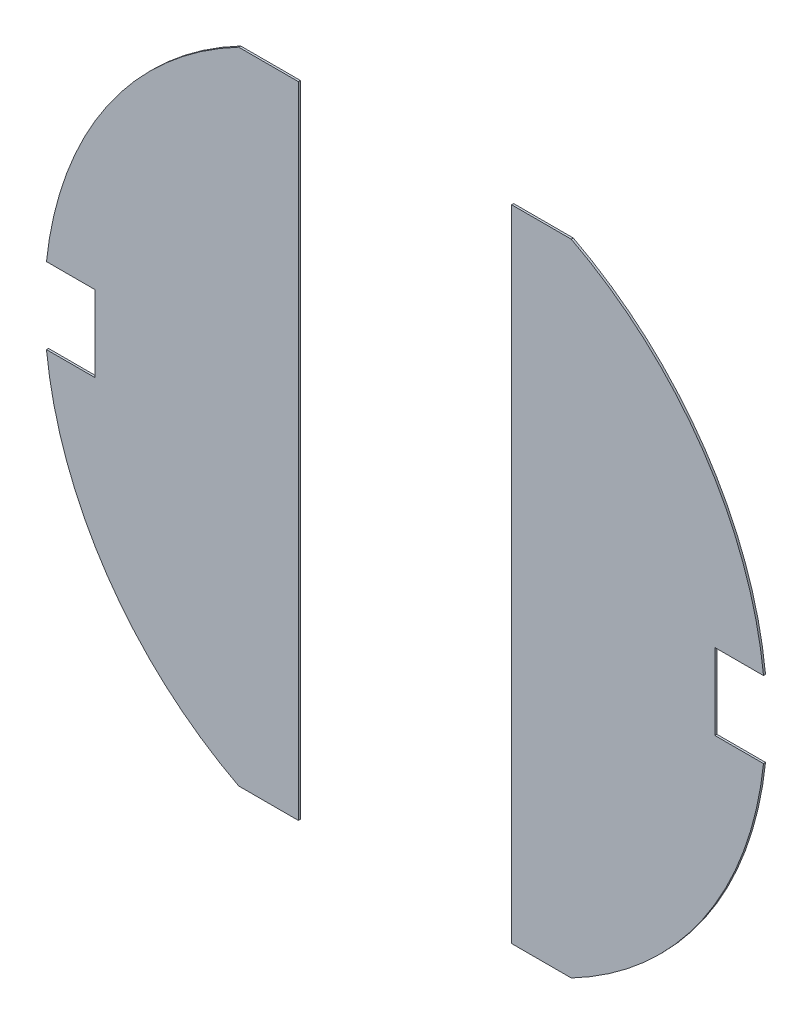
ISO-10303-21;
HEADER;
FILE_DESCRIPTION(('STEP AP214'),'2;1');
FILE_NAME('part.step','',(''),(''),'','','');
FILE_SCHEMA(('AUTOMOTIVE_DESIGN { 1 0 10303 214 1 1 1 1 }'));
ENDSEC;
DATA;
#1=APPLICATION_CONTEXT('core data for automotive mechanical design processes');
#2=APPLICATION_PROTOCOL_DEFINITION('international standard','automotive_design',2000,#1);
#3=PRODUCT_CONTEXT('',#1,'mechanical');
#4=PRODUCT('Part','Part','',(#3));
#5=PRODUCT_RELATED_PRODUCT_CATEGORY('part','',(#4));
#6=PRODUCT_DEFINITION_FORMATION('','',#4);
#7=PRODUCT_DEFINITION_CONTEXT('part definition',#1,'design');
#8=PRODUCT_DEFINITION('design','',#6,#7);
#9=PRODUCT_DEFINITION_SHAPE('','',#8);
#10=(LENGTH_UNIT() NAMED_UNIT(*) SI_UNIT(.MILLI.,.METRE.));
#11=(NAMED_UNIT(*) PLANE_ANGLE_UNIT() SI_UNIT($,.RADIAN.));
#12=(NAMED_UNIT(*) SI_UNIT($,.STERADIAN.) SOLID_ANGLE_UNIT());
#13=UNCERTAINTY_MEASURE_WITH_UNIT(LENGTH_MEASURE(1.E-05),#10,'distance_accuracy_value','');
#14=(GEOMETRIC_REPRESENTATION_CONTEXT(3) GLOBAL_UNCERTAINTY_ASSIGNED_CONTEXT((#13)) GLOBAL_UNIT_ASSIGNED_CONTEXT((#10,
#11,#12)) REPRESENTATION_CONTEXT('',''));
#15=CARTESIAN_POINT('',(0.,0.,0.));
#16=DIRECTION('',(0.,0.,1.));
#17=DIRECTION('',(1.,0.,0.));
#18=AXIS2_PLACEMENT_3D('',#15,#16,#17);
#19=CARTESIAN_POINT('',(-1.637070554374,3.15,0.02));
#20=DIRECTION('',(0.,0.,-1.));
#21=DIRECTION('',(0.,1.,0.));
#22=AXIS2_PLACEMENT_3D('',#19,#20,#21);
#23=PLANE('',#22);
#24=DIRECTION('',(1.,0.,0.));
#25=VECTOR('',#24,1.);
#26=CARTESIAN_POINT('',(-3.530138099282,0.375,0.02));
#27=LINE('',#26,#25);
#28=CARTESIAN_POINT('',(-3.53013809928167,0.374999999999983,0.02));
#29=VERTEX_POINT('',#28);
#30=CARTESIAN_POINT('',(-3.05,0.375,0.02));
#31=VERTEX_POINT('',#30);
#32=EDGE_CURVE('P0_E119',#29,#31,#27,.T.);
#33=ORIENTED_EDGE('',*,*,#32,.T.);
#34=DIRECTION('',(0.,1.,0.));
#35=VECTOR('',#34,1.);
#36=CARTESIAN_POINT('',(-3.05,0.375,0.02));
#37=LINE('',#36,#35);
#38=CARTESIAN_POINT('',(-3.05,-0.375,0.02));
#39=VERTEX_POINT('',#38);
#40=EDGE_CURVE('P0_E126',#31,#39,#37,.F.);
#41=ORIENTED_EDGE('',*,*,#40,.T.);
#42=DIRECTION('',(1.,0.,0.));
#43=VECTOR('',#42,1.);
#44=CARTESIAN_POINT('',(-3.05,-0.375,0.02));
#45=LINE('',#44,#43);
#46=CARTESIAN_POINT('',(-3.53013809928183,-0.375,0.0200000000000002));
#47=VERTEX_POINT('',#46);
#48=EDGE_CURVE('P0_E132',#39,#47,#45,.F.);
#49=ORIENTED_EDGE('',*,*,#48,.T.);
#50=CARTESIAN_POINT('',(0.,0.,0.0200000000000004));
#51=DIRECTION('',(0.,0.,-1.));
#52=DIRECTION('',(0.,1.,0.));
#53=AXIS2_PLACEMENT_3D('',#50,#51,#52);
#54=CIRCLE('',#53,3.55);
#55=CARTESIAN_POINT('',(-1.6370705543743,-3.1500000000001,0.02));
#56=VERTEX_POINT('',#55);
#57=EDGE_CURVE('P0_E20',#56,#47,#54,.T.);
#58=ORIENTED_EDGE('',*,*,#57,.F.);
#59=DIRECTION('',(1.,0.,0.));
#60=VECTOR('',#59,1.);
#61=CARTESIAN_POINT('',(-1.05,-3.15,0.02));
#62=LINE('',#61,#60);
#63=CARTESIAN_POINT('',(-1.05,-3.15,0.02));
#64=VERTEX_POINT('',#63);
#65=EDGE_CURVE('P0_E66',#64,#56,#62,.F.);
#66=ORIENTED_EDGE('',*,*,#65,.F.);
#67=DIRECTION('',(0.,1.,0.));
#68=VECTOR('',#67,1.);
#69=CARTESIAN_POINT('',(-1.05,3.15,0.02));
#70=LINE('',#69,#68);
#71=CARTESIAN_POINT('',(-1.05,3.15,0.02));
#72=VERTEX_POINT('',#71);
#73=EDGE_CURVE('P0_E76',#72,#64,#70,.F.);
#74=ORIENTED_EDGE('',*,*,#73,.F.);
#75=DIRECTION('',(1.,0.,0.));
#76=VECTOR('',#75,1.);
#77=CARTESIAN_POINT('',(-1.637070554374,3.15,0.02));
#78=LINE('',#77,#76);
#79=CARTESIAN_POINT('',(-1.6370705543743,3.1500000000001,0.0200000000000003));
#80=VERTEX_POINT('',#79);
#81=EDGE_CURVE('P0_E113',#80,#72,#78,.T.);
#82=ORIENTED_EDGE('',*,*,#81,.F.);
#83=CARTESIAN_POINT('',(0.,0.,0.02));
#84=DIRECTION('',(0.,0.,-1.));
#85=DIRECTION('',(0.,1.,0.));
#86=AXIS2_PLACEMENT_3D('',#83,#84,#85);
#87=CIRCLE('',#86,3.55);
#88=EDGE_CURVE('P0_E143',#29,#80,#87,.T.);
#89=ORIENTED_EDGE('',*,*,#88,.F.);
#90=EDGE_LOOP('',(#33,#41,#49,#58,#66,#74,#82,#89));
#91=FACE_BOUND('',#90,.T.);
#92=ADVANCED_FACE('P0_F17',(#91),#23,.F.);
#93=CARTESIAN_POINT('',(-1.637070554374,3.15,0.));
#94=DIRECTION('',(0.,1.,0.));
#95=DIRECTION('',(0.,0.,1.));
#96=AXIS2_PLACEMENT_3D('',#93,#94,#95);
#97=PLANE('',#96);
#98=DIRECTION('',(0.,0.,-1.));
#99=VECTOR('',#98,1.);
#100=CARTESIAN_POINT('',(-1.05,3.15,0.));
#101=LINE('',#100,#99);
#102=CARTESIAN_POINT('',(-1.05,3.15,0.));
#103=VERTEX_POINT('',#102);
#104=EDGE_CURVE('P0_E82',#103,#72,#101,.F.);
#105=ORIENTED_EDGE('',*,*,#104,.F.);
#106=DIRECTION('',(1.,0.,0.));
#107=VECTOR('',#106,1.);
#108=CARTESIAN_POINT('',(-1.637070554374,3.15,0.));
#109=LINE('',#108,#107);
#110=CARTESIAN_POINT('',(-1.6370705543743,3.1500000000001,0.));
#111=VERTEX_POINT('',#110);
#112=EDGE_CURVE('P0_E103',#111,#103,#109,.T.);
#113=ORIENTED_EDGE('',*,*,#112,.F.);
#114=DIRECTION('',(0.,0.,-1.));
#115=VECTOR('',#114,1.);
#116=CARTESIAN_POINT('',(-1.63707055437411,3.1500000000002,0.));
#117=LINE('',#116,#115);
#118=EDGE_CURVE('P0_E105',#80,#111,#117,.T.);
#119=ORIENTED_EDGE('',*,*,#118,.F.);
#120=ORIENTED_EDGE('',*,*,#81,.T.);
#121=EDGE_LOOP('',(#105,#113,#119,#120));
#122=FACE_BOUND('',#121,.T.);
#123=ADVANCED_FACE('P0_F194',(#122),#97,.T.);
#124=CARTESIAN_POINT('',(-1.05,3.15,0.));
#125=DIRECTION('',(1.,0.,0.));
#126=DIRECTION('',(0.,0.,-1.));
#127=AXIS2_PLACEMENT_3D('',#124,#125,#126);
#128=PLANE('',#127);
#129=DIRECTION('',(0.,0.,-1.));
#130=VECTOR('',#129,1.);
#131=CARTESIAN_POINT('',(-1.05,-3.15,0.));
#132=LINE('',#131,#130);
#133=CARTESIAN_POINT('',(-1.05,-3.15,0.));
#134=VERTEX_POINT('',#133);
#135=EDGE_CURVE('P0_E84',#134,#64,#132,.F.);
#136=ORIENTED_EDGE('',*,*,#135,.F.);
#137=DIRECTION('',(0.,1.,0.));
#138=VECTOR('',#137,1.);
#139=CARTESIAN_POINT('',(-1.05,3.15,0.));
#140=LINE('',#139,#138);
#141=EDGE_CURVE('P0_E88',#103,#134,#140,.F.);
#142=ORIENTED_EDGE('',*,*,#141,.F.);
#143=ORIENTED_EDGE('',*,*,#104,.T.);
#144=ORIENTED_EDGE('',*,*,#73,.T.);
#145=EDGE_LOOP('',(#136,#142,#143,#144));
#146=FACE_BOUND('',#145,.T.);
#147=ADVANCED_FACE('P0_F86',(#146),#128,.T.);
#148=CARTESIAN_POINT('',(-1.05,-3.15,0.));
#149=DIRECTION('',(0.,-1.,0.));
#150=DIRECTION('',(0.,0.,-1.));
#151=AXIS2_PLACEMENT_3D('',#148,#149,#150);
#152=PLANE('',#151);
#153=DIRECTION('',(0.,0.,-1.));
#154=VECTOR('',#153,1.);
#155=CARTESIAN_POINT('',(-1.6370705543741,-3.1500000000002,0.));
#156=LINE('',#155,#154);
#157=CARTESIAN_POINT('',(-1.6370705543743,-3.1500000000001,0.));
#158=VERTEX_POINT('',#157);
#159=EDGE_CURVE('P0_E95',#158,#56,#156,.F.);
#160=ORIENTED_EDGE('',*,*,#159,.F.);
#161=DIRECTION('',(1.,0.,0.));
#162=VECTOR('',#161,1.);
#163=CARTESIAN_POINT('',(-1.637070554374,-3.15,0.));
#164=LINE('',#163,#162);
#165=EDGE_CURVE('P0_E92',#134,#158,#164,.F.);
#166=ORIENTED_EDGE('',*,*,#165,.F.);
#167=ORIENTED_EDGE('',*,*,#135,.T.);
#168=ORIENTED_EDGE('',*,*,#65,.T.);
#169=EDGE_LOOP('',(#160,#166,#167,#168));
#170=FACE_BOUND('',#169,.T.);
#171=ADVANCED_FACE('P0_F93',(#170),#152,.T.);
#172=CARTESIAN_POINT('',(0.,0.,0.));
#173=DIRECTION('',(0.,0.,-1.));
#174=DIRECTION('',(0.,1.,0.));
#175=AXIS2_PLACEMENT_3D('',#172,#173,#174);
#176=CYLINDRICAL_SURFACE('',#175,3.55);
#177=ORIENTED_EDGE('',*,*,#57,.T.);
#178=DIRECTION('',(0.,0.,-1.));
#179=VECTOR('',#178,1.);
#180=CARTESIAN_POINT('',(-3.530138099282,-0.375,0.));
#181=LINE('',#180,#179);
#182=CARTESIAN_POINT('',(-3.53013809928183,-0.375,0.));
#183=VERTEX_POINT('',#182);
#184=EDGE_CURVE('P0_E129',#47,#183,#181,.T.);
#185=ORIENTED_EDGE('',*,*,#184,.T.);
#186=CARTESIAN_POINT('',(0.,0.,0.));
#187=DIRECTION('',(0.,0.,-1.));
#188=DIRECTION('',(0.,1.,0.));
#189=AXIS2_PLACEMENT_3D('',#186,#187,#188);
#190=CIRCLE('',#189,3.55);
#191=EDGE_CURVE('P0_E99',#158,#183,#190,.T.);
#192=ORIENTED_EDGE('',*,*,#191,.F.);
#193=ORIENTED_EDGE('',*,*,#159,.T.);
#194=EDGE_LOOP('',(#177,#185,#192,#193));
#195=FACE_BOUND('',#194,.T.);
#196=ADVANCED_FACE('P0_F168',(#195),#176,.T.);
#197=CARTESIAN_POINT('',(-3.05,-0.375,0.));
#198=DIRECTION('',(0.,-1.,0.));
#199=DIRECTION('',(0.,0.,-1.));
#200=AXIS2_PLACEMENT_3D('',#197,#198,#199);
#201=PLANE('',#200);
#202=ORIENTED_EDGE('',*,*,#184,.F.);
#203=ORIENTED_EDGE('',*,*,#48,.F.);
#204=DIRECTION('',(0.,0.,-1.));
#205=VECTOR('',#204,1.);
#206=CARTESIAN_POINT('',(-3.05,-0.375,0.));
#207=LINE('',#206,#205);
#208=CARTESIAN_POINT('',(-3.05,-0.375,0.));
#209=VERTEX_POINT('',#208);
#210=EDGE_CURVE('P0_E123',#39,#209,#207,.T.);
#211=ORIENTED_EDGE('',*,*,#210,.T.);
#212=DIRECTION('',(1.,0.,0.));
#213=VECTOR('',#212,1.);
#214=CARTESIAN_POINT('',(-1.637070554374,-0.375,0.));
#215=LINE('',#214,#213);
#216=EDGE_CURVE('P0_E142',#183,#209,#215,.T.);
#217=ORIENTED_EDGE('',*,*,#216,.F.);
#218=EDGE_LOOP('',(#202,#203,#211,#217));
#219=FACE_BOUND('',#218,.T.);
#220=ADVANCED_FACE('P0_F173',(#219),#201,.F.);
#221=CARTESIAN_POINT('',(-3.05,0.375,0.));
#222=DIRECTION('',(1.,0.,0.));
#223=DIRECTION('',(0.,0.,-1.));
#224=AXIS2_PLACEMENT_3D('',#221,#222,#223);
#225=PLANE('',#224);
#226=ORIENTED_EDGE('',*,*,#210,.F.);
#227=ORIENTED_EDGE('',*,*,#40,.F.);
#228=DIRECTION('',(0.,0.,1.));
#229=VECTOR('',#228,1.);
#230=CARTESIAN_POINT('',(-3.05,0.375,0.));
#231=LINE('',#230,#229);
#232=CARTESIAN_POINT('',(-3.05,0.375,0.));
#233=VERTEX_POINT('',#232);
#234=EDGE_CURVE('P0_E122',#31,#233,#231,.F.);
#235=ORIENTED_EDGE('',*,*,#234,.T.);
#236=DIRECTION('',(0.,1.,0.));
#237=VECTOR('',#236,1.);
#238=CARTESIAN_POINT('',(-3.05,3.15,0.));
#239=LINE('',#238,#237);
#240=EDGE_CURVE('P0_E155',#209,#233,#239,.T.);
#241=ORIENTED_EDGE('',*,*,#240,.F.);
#242=EDGE_LOOP('',(#226,#227,#235,#241));
#243=FACE_BOUND('',#242,.T.);
#244=ADVANCED_FACE('P0_F191',(#243),#225,.F.);
#245=CARTESIAN_POINT('',(-3.530138099282,0.375,0.));
#246=DIRECTION('',(0.,1.,0.));
#247=DIRECTION('',(0.,0.,1.));
#248=AXIS2_PLACEMENT_3D('',#245,#246,#247);
#249=PLANE('',#248);
#250=ORIENTED_EDGE('',*,*,#234,.F.);
#251=ORIENTED_EDGE('',*,*,#32,.F.);
#252=DIRECTION('',(0.,0.,-1.));
#253=VECTOR('',#252,1.);
#254=CARTESIAN_POINT('',(-3.53013809928167,0.374999999999965,0.));
#255=LINE('',#254,#253);
#256=CARTESIAN_POINT('',(-3.53013809928167,0.374999999999983,0.));
#257=VERTEX_POINT('',#256);
#258=EDGE_CURVE('P0_E35',#257,#29,#255,.F.);
#259=ORIENTED_EDGE('',*,*,#258,.F.);
#260=DIRECTION('',(1.,0.,0.));
#261=VECTOR('',#260,1.);
#262=CARTESIAN_POINT('',(-1.637070554374,0.375,0.));
#263=LINE('',#262,#261);
#264=EDGE_CURVE('P0_E26',#233,#257,#263,.F.);
#265=ORIENTED_EDGE('',*,*,#264,.F.);
#266=EDGE_LOOP('',(#250,#251,#259,#265));
#267=FACE_BOUND('',#266,.T.);
#268=ADVANCED_FACE('P0_F187',(#267),#249,.F.);
#269=CARTESIAN_POINT('',(0.,0.,0.));
#270=DIRECTION('',(0.,0.,-1.));
#271=DIRECTION('',(0.,1.,0.));
#272=AXIS2_PLACEMENT_3D('',#269,#270,#271);
#273=CYLINDRICAL_SURFACE('',#272,3.55);
#274=ORIENTED_EDGE('',*,*,#88,.T.);
#275=ORIENTED_EDGE('',*,*,#118,.T.);
#276=CARTESIAN_POINT('',(0.,0.,0.));
#277=DIRECTION('',(0.,0.,-1.));
#278=DIRECTION('',(0.,1.,0.));
#279=AXIS2_PLACEMENT_3D('',#276,#277,#278);
#280=CIRCLE('',#279,3.55);
#281=EDGE_CURVE('P0_E11',#257,#111,#280,.T.);
#282=ORIENTED_EDGE('',*,*,#281,.F.);
#283=ORIENTED_EDGE('',*,*,#258,.T.);
#284=EDGE_LOOP('',(#274,#275,#282,#283));
#285=FACE_BOUND('',#284,.T.);
#286=ADVANCED_FACE('P0_F195',(#285),#273,.T.);
#287=CARTESIAN_POINT('',(-1.637070554374,3.15,0.));
#288=DIRECTION('',(0.,0.,-1.));
#289=DIRECTION('',(0.,1.,0.));
#290=AXIS2_PLACEMENT_3D('',#287,#288,#289);
#291=PLANE('',#290);
#292=ORIENTED_EDGE('',*,*,#264,.T.);
#293=ORIENTED_EDGE('',*,*,#281,.T.);
#294=ORIENTED_EDGE('',*,*,#112,.T.);
#295=ORIENTED_EDGE('',*,*,#141,.T.);
#296=ORIENTED_EDGE('',*,*,#165,.T.);
#297=ORIENTED_EDGE('',*,*,#191,.T.);
#298=ORIENTED_EDGE('',*,*,#216,.T.);
#299=ORIENTED_EDGE('',*,*,#240,.T.);
#300=EDGE_LOOP('',(#292,#293,#294,#295,#296,#297,#298,#299));
#301=FACE_BOUND('',#300,.T.);
#302=ADVANCED_FACE('P0_F102',(#301),#291,.T.);
#303=CLOSED_SHELL('',(#92,#123,#147,#171,#196,#220,#244,#268,#286,#302));
#304=MANIFOLD_SOLID_BREP('P0_B1',#303);
#305=CARTESIAN_POINT('',(1.05,-3.15,0.02));
#306=DIRECTION('',(0.,0.,-1.));
#307=DIRECTION('',(0.,1.,0.));
#308=AXIS2_PLACEMENT_3D('',#305,#306,#307);
#309=PLANE('',#308);
#310=CARTESIAN_POINT('',(0.,0.,0.02));
#311=DIRECTION('',(0.,0.,-1.));
#312=DIRECTION('',(0.,1.,0.));
#313=AXIS2_PLACEMENT_3D('',#310,#311,#312);
#314=CIRCLE('',#313,3.55);
#315=CARTESIAN_POINT('',(3.53013809928167,-0.374999999999983,0.02));
#316=VERTEX_POINT('',#315);
#317=CARTESIAN_POINT('',(1.63707055437424,-3.15,0.0199999999999998));
#318=VERTEX_POINT('',#317);
#319=EDGE_CURVE('P1_E92',#316,#318,#314,.T.);
#320=ORIENTED_EDGE('',*,*,#319,.F.);
#321=DIRECTION('',(1.,0.,0.));
#322=VECTOR('',#321,1.);
#323=CARTESIAN_POINT('',(3.530138099282,-0.375,0.02));
#324=LINE('',#323,#322);
#325=CARTESIAN_POINT('',(3.05,-0.375,0.02));
#326=VERTEX_POINT('',#325);
#327=EDGE_CURVE('P1_E109',#316,#326,#324,.F.);
#328=ORIENTED_EDGE('',*,*,#327,.T.);
#329=DIRECTION('',(0.,1.,0.));
#330=VECTOR('',#329,1.);
#331=CARTESIAN_POINT('',(3.05,-0.375,0.02));
#332=LINE('',#331,#330);
#333=CARTESIAN_POINT('',(3.05,0.375,0.02));
#334=VERTEX_POINT('',#333);
#335=EDGE_CURVE('P1_E122',#326,#334,#332,.T.);
#336=ORIENTED_EDGE('',*,*,#335,.T.);
#337=DIRECTION('',(1.,0.,0.));
#338=VECTOR('',#337,1.);
#339=CARTESIAN_POINT('',(3.05,0.375,0.02));
#340=LINE('',#339,#338);
#341=CARTESIAN_POINT('',(3.53013809928183,0.375,0.0199999999999998));
#342=VERTEX_POINT('',#341);
#343=EDGE_CURVE('P1_E127',#334,#342,#340,.T.);
#344=ORIENTED_EDGE('',*,*,#343,.T.);
#345=CARTESIAN_POINT('',(0.,0.,0.0199999999999996));
#346=DIRECTION('',(0.,0.,-1.));
#347=DIRECTION('',(0.,1.,0.));
#348=AXIS2_PLACEMENT_3D('',#345,#346,#347);
#349=CIRCLE('',#348,3.55);
#350=CARTESIAN_POINT('',(1.6370705543743,3.1500000000001,0.02));
#351=VERTEX_POINT('',#350);
#352=EDGE_CURVE('P1_E20',#351,#342,#349,.T.);
#353=ORIENTED_EDGE('',*,*,#352,.F.);
#354=DIRECTION('',(1.,0.,0.));
#355=VECTOR('',#354,1.);
#356=CARTESIAN_POINT('',(1.05,3.15,0.02));
#357=LINE('',#356,#355);
#358=CARTESIAN_POINT('',(1.05,3.15,0.02));
#359=VERTEX_POINT('',#358);
#360=EDGE_CURVE('P1_E64',#359,#351,#357,.T.);
#361=ORIENTED_EDGE('',*,*,#360,.F.);
#362=DIRECTION('',(0.,1.,0.));
#363=VECTOR('',#362,1.);
#364=CARTESIAN_POINT('',(1.05,-3.15,0.02));
#365=LINE('',#364,#363);
#366=CARTESIAN_POINT('',(1.05,-3.15,0.02));
#367=VERTEX_POINT('',#366);
#368=EDGE_CURVE('P1_E74',#367,#359,#365,.T.);
#369=ORIENTED_EDGE('',*,*,#368,.F.);
#370=DIRECTION('',(1.,0.,0.));
#371=VECTOR('',#370,1.);
#372=CARTESIAN_POINT('',(1.05,-3.15,0.02));
#373=LINE('',#372,#371);
#374=EDGE_CURVE('P1_E80',#318,#367,#373,.F.);
#375=ORIENTED_EDGE('',*,*,#374,.F.);
#376=EDGE_LOOP('',(#320,#328,#336,#344,#353,#361,#369,#375));
#377=FACE_BOUND('',#376,.T.);
#378=ADVANCED_FACE('P1_F17',(#377),#309,.F.);
#379=CARTESIAN_POINT('',(1.05,-3.15,0.));
#380=DIRECTION('',(-1.,0.,0.));
#381=DIRECTION('',(0.,0.,1.));
#382=AXIS2_PLACEMENT_3D('',#379,#380,#381);
#383=PLANE('',#382);
#384=DIRECTION('',(0.,0.,1.));
#385=VECTOR('',#384,1.);
#386=CARTESIAN_POINT('',(1.05,3.15,0.));
#387=LINE('',#386,#385);
#388=CARTESIAN_POINT('',(1.05,3.15,0.));
#389=VERTEX_POINT('',#388);
#390=EDGE_CURVE('P1_E86',#389,#359,#387,.T.);
#391=ORIENTED_EDGE('',*,*,#390,.F.);
#392=DIRECTION('',(0.,1.,0.));
#393=VECTOR('',#392,1.);
#394=CARTESIAN_POINT('',(1.05,-3.15,0.));
#395=LINE('',#394,#393);
#396=CARTESIAN_POINT('',(1.05,-3.15,0.));
#397=VERTEX_POINT('',#396);
#398=EDGE_CURVE('P1_E91',#397,#389,#395,.T.);
#399=ORIENTED_EDGE('',*,*,#398,.F.);
#400=DIRECTION('',(0.,0.,1.));
#401=VECTOR('',#400,1.);
#402=CARTESIAN_POINT('',(1.05,-3.15,0.));
#403=LINE('',#402,#401);
#404=EDGE_CURVE('P1_E82',#397,#367,#403,.T.);
#405=ORIENTED_EDGE('',*,*,#404,.T.);
#406=ORIENTED_EDGE('',*,*,#368,.T.);
#407=EDGE_LOOP('',(#391,#399,#405,#406));
#408=FACE_BOUND('',#407,.T.);
#409=ADVANCED_FACE('P1_F89',(#408),#383,.T.);
#410=CARTESIAN_POINT('',(1.05,3.15,0.));
#411=DIRECTION('',(0.,1.,0.));
#412=DIRECTION('',(0.,0.,1.));
#413=AXIS2_PLACEMENT_3D('',#410,#411,#412);
#414=PLANE('',#413);
#415=DIRECTION('',(0.,0.,-1.));
#416=VECTOR('',#415,1.);
#417=CARTESIAN_POINT('',(1.6370705543741,3.1500000000002,0.));
#418=LINE('',#417,#416);
#419=CARTESIAN_POINT('',(1.6370705543743,3.1500000000001,0.));
#420=VERTEX_POINT('',#419);
#421=EDGE_CURVE('P1_E128',#420,#351,#418,.F.);
#422=ORIENTED_EDGE('',*,*,#421,.F.);
#423=DIRECTION('',(1.,0.,0.));
#424=VECTOR('',#423,1.);
#425=CARTESIAN_POINT('',(1.05,3.15,0.));
#426=LINE('',#425,#424);
#427=EDGE_CURVE('P1_E101',#389,#420,#426,.T.);
#428=ORIENTED_EDGE('',*,*,#427,.F.);
#429=ORIENTED_EDGE('',*,*,#390,.T.);
#430=ORIENTED_EDGE('',*,*,#360,.T.);
#431=EDGE_LOOP('',(#422,#428,#429,#430));
#432=FACE_BOUND('',#431,.T.);
#433=ADVANCED_FACE('P1_F255',(#432),#414,.T.);
#434=CARTESIAN_POINT('',(0.,0.,0.));
#435=DIRECTION('',(0.,0.,-1.));
#436=DIRECTION('',(0.,1.,0.));
#437=AXIS2_PLACEMENT_3D('',#434,#435,#436);
#438=CYLINDRICAL_SURFACE('',#437,3.55);
#439=ORIENTED_EDGE('',*,*,#352,.T.);
#440=DIRECTION('',(0.,0.,1.));
#441=VECTOR('',#440,1.);
#442=CARTESIAN_POINT('',(3.530138099282,0.375,0.));
#443=LINE('',#442,#441);
#444=CARTESIAN_POINT('',(3.53013809928183,0.375,0.));
#445=VERTEX_POINT('',#444);
#446=EDGE_CURVE('P1_E125',#342,#445,#443,.F.);
#447=ORIENTED_EDGE('',*,*,#446,.T.);
#448=CARTESIAN_POINT('',(0.,0.,0.));
#449=DIRECTION('',(0.,0.,-1.));
#450=DIRECTION('',(0.,1.,0.));
#451=AXIS2_PLACEMENT_3D('',#448,#449,#450);
#452=CIRCLE('',#451,3.55);
#453=EDGE_CURVE('P1_E154',#420,#445,#452,.T.);
#454=ORIENTED_EDGE('',*,*,#453,.F.);
#455=ORIENTED_EDGE('',*,*,#421,.T.);
#456=EDGE_LOOP('',(#439,#447,#454,#455));
#457=FACE_BOUND('',#456,.T.);
#458=ADVANCED_FACE('P1_F201',(#457),#438,.T.);
#459=CARTESIAN_POINT('',(3.05,0.375,0.));
#460=DIRECTION('',(0.,1.,0.));
#461=DIRECTION('',(0.,0.,1.));
#462=AXIS2_PLACEMENT_3D('',#459,#460,#461);
#463=PLANE('',#462);
#464=ORIENTED_EDGE('',*,*,#446,.F.);
#465=ORIENTED_EDGE('',*,*,#343,.F.);
#466=DIRECTION('',(0.,0.,1.));
#467=VECTOR('',#466,1.);
#468=CARTESIAN_POINT('',(3.05,0.375,0.));
#469=LINE('',#468,#467);
#470=CARTESIAN_POINT('',(3.05,0.375,0.));
#471=VERTEX_POINT('',#470);
#472=EDGE_CURVE('P1_E119',#334,#471,#469,.F.);
#473=ORIENTED_EDGE('',*,*,#472,.T.);
#474=DIRECTION('',(1.,0.,0.));
#475=VECTOR('',#474,1.);
#476=CARTESIAN_POINT('',(1.05,0.375,0.));
#477=LINE('',#476,#475);
#478=EDGE_CURVE('P1_E116',#445,#471,#477,.F.);
#479=ORIENTED_EDGE('',*,*,#478,.F.);
#480=EDGE_LOOP('',(#464,#465,#473,#479));
#481=FACE_BOUND('',#480,.T.);
#482=ADVANCED_FACE('P1_F189',(#481),#463,.F.);
#483=CARTESIAN_POINT('',(3.05,-0.375,0.));
#484=DIRECTION('',(-1.,0.,0.));
#485=DIRECTION('',(0.,0.,1.));
#486=AXIS2_PLACEMENT_3D('',#483,#484,#485);
#487=PLANE('',#486);
#488=ORIENTED_EDGE('',*,*,#472,.F.);
#489=ORIENTED_EDGE('',*,*,#335,.F.);
#490=DIRECTION('',(0.,0.,-1.));
#491=VECTOR('',#490,1.);
#492=CARTESIAN_POINT('',(3.05,-0.375,0.));
#493=LINE('',#492,#491);
#494=CARTESIAN_POINT('',(3.05,-0.375,0.));
#495=VERTEX_POINT('',#494);
#496=EDGE_CURVE('P1_E106',#326,#495,#493,.T.);
#497=ORIENTED_EDGE('',*,*,#496,.T.);
#498=DIRECTION('',(0.,1.,0.));
#499=VECTOR('',#498,1.);
#500=CARTESIAN_POINT('',(3.05,-3.15,0.));
#501=LINE('',#500,#499);
#502=EDGE_CURVE('P1_E112',#471,#495,#501,.F.);
#503=ORIENTED_EDGE('',*,*,#502,.F.);
#504=EDGE_LOOP('',(#488,#489,#497,#503));
#505=FACE_BOUND('',#504,.T.);
#506=ADVANCED_FACE('P1_F191',(#505),#487,.F.);
#507=CARTESIAN_POINT('',(3.530138099282,-0.375,0.));
#508=DIRECTION('',(0.,-1.,0.));
#509=DIRECTION('',(0.,0.,-1.));
#510=AXIS2_PLACEMENT_3D('',#507,#508,#509);
#511=PLANE('',#510);
#512=ORIENTED_EDGE('',*,*,#496,.F.);
#513=ORIENTED_EDGE('',*,*,#327,.F.);
#514=DIRECTION('',(0.,0.,-1.));
#515=VECTOR('',#514,1.);
#516=CARTESIAN_POINT('',(3.53013809928167,-0.374999999999965,0.));
#517=LINE('',#516,#515);
#518=CARTESIAN_POINT('',(3.53013809928167,-0.374999999999983,0.));
#519=VERTEX_POINT('',#518);
#520=EDGE_CURVE('P1_E95',#519,#316,#517,.F.);
#521=ORIENTED_EDGE('',*,*,#520,.F.);
#522=DIRECTION('',(1.,0.,0.));
#523=VECTOR('',#522,1.);
#524=CARTESIAN_POINT('',(1.05,-0.375,0.));
#525=LINE('',#524,#523);
#526=EDGE_CURVE('P1_E115',#495,#519,#525,.T.);
#527=ORIENTED_EDGE('',*,*,#526,.F.);
#528=EDGE_LOOP('',(#512,#513,#521,#527));
#529=FACE_BOUND('',#528,.T.);
#530=ADVANCED_FACE('P1_F177',(#529),#511,.F.);
#531=CARTESIAN_POINT('',(0.,0.,0.));
#532=DIRECTION('',(0.,0.,-1.));
#533=DIRECTION('',(0.,1.,0.));
#534=AXIS2_PLACEMENT_3D('',#531,#532,#533);
#535=CYLINDRICAL_SURFACE('',#534,3.55);
#536=ORIENTED_EDGE('',*,*,#319,.T.);
#537=DIRECTION('',(0.,0.,1.));
#538=VECTOR('',#537,1.);
#539=CARTESIAN_POINT('',(1.637070554374,-3.15,0.));
#540=LINE('',#539,#538);
#541=CARTESIAN_POINT('',(1.63707055437424,-3.15,0.));
#542=VERTEX_POINT('',#541);
#543=EDGE_CURVE('P1_E35',#318,#542,#540,.F.);
#544=ORIENTED_EDGE('',*,*,#543,.T.);
#545=CARTESIAN_POINT('',(0.,0.,0.));
#546=DIRECTION('',(0.,0.,-1.));
#547=DIRECTION('',(0.,1.,0.));
#548=AXIS2_PLACEMENT_3D('',#545,#546,#547);
#549=CIRCLE('',#548,3.55);
#550=EDGE_CURVE('P1_E26',#519,#542,#549,.T.);
#551=ORIENTED_EDGE('',*,*,#550,.F.);
#552=ORIENTED_EDGE('',*,*,#520,.T.);
#553=EDGE_LOOP('',(#536,#544,#551,#552));
#554=FACE_BOUND('',#553,.T.);
#555=ADVANCED_FACE('P1_F199',(#554),#535,.T.);
#556=CARTESIAN_POINT('',(1.05,-3.15,0.));
#557=DIRECTION('',(0.,1.,0.));
#558=DIRECTION('',(0.,0.,1.));
#559=AXIS2_PLACEMENT_3D('',#556,#557,#558);
#560=PLANE('',#559);
#561=ORIENTED_EDGE('',*,*,#543,.F.);
#562=ORIENTED_EDGE('',*,*,#374,.T.);
#563=ORIENTED_EDGE('',*,*,#404,.F.);
#564=DIRECTION('',(1.,0.,0.));
#565=VECTOR('',#564,1.);
#566=CARTESIAN_POINT('',(1.05,-3.15,0.));
#567=LINE('',#566,#565);
#568=EDGE_CURVE('P1_E11',#542,#397,#567,.F.);
#569=ORIENTED_EDGE('',*,*,#568,.F.);
#570=EDGE_LOOP('',(#561,#562,#563,#569));
#571=FACE_BOUND('',#570,.T.);
#572=ADVANCED_FACE('P1_F81',(#571),#560,.F.);
#573=CARTESIAN_POINT('',(1.05,-3.15,0.));
#574=DIRECTION('',(0.,0.,-1.));
#575=DIRECTION('',(0.,1.,0.));
#576=AXIS2_PLACEMENT_3D('',#573,#574,#575);
#577=PLANE('',#576);
#578=ORIENTED_EDGE('',*,*,#550,.T.);
#579=ORIENTED_EDGE('',*,*,#568,.T.);
#580=ORIENTED_EDGE('',*,*,#398,.T.);
#581=ORIENTED_EDGE('',*,*,#427,.T.);
#582=ORIENTED_EDGE('',*,*,#453,.T.);
#583=ORIENTED_EDGE('',*,*,#478,.T.);
#584=ORIENTED_EDGE('',*,*,#502,.T.);
#585=ORIENTED_EDGE('',*,*,#526,.T.);
#586=EDGE_LOOP('',(#578,#579,#580,#581,#582,#583,#584,#585));
#587=FACE_BOUND('',#586,.T.);
#588=ADVANCED_FACE('P1_F173',(#587),#577,.T.);
#589=CLOSED_SHELL('',(#378,#409,#433,#458,#482,#506,#530,#555,#572,#588));
#590=MANIFOLD_SOLID_BREP('P1_B1',#589);
#591=ADVANCED_BREP_SHAPE_REPRESENTATION('',(#18,#304,#590),#14);
#592=SHAPE_DEFINITION_REPRESENTATION(#9,#591);
ENDSEC;
END-ISO-10303-21;
